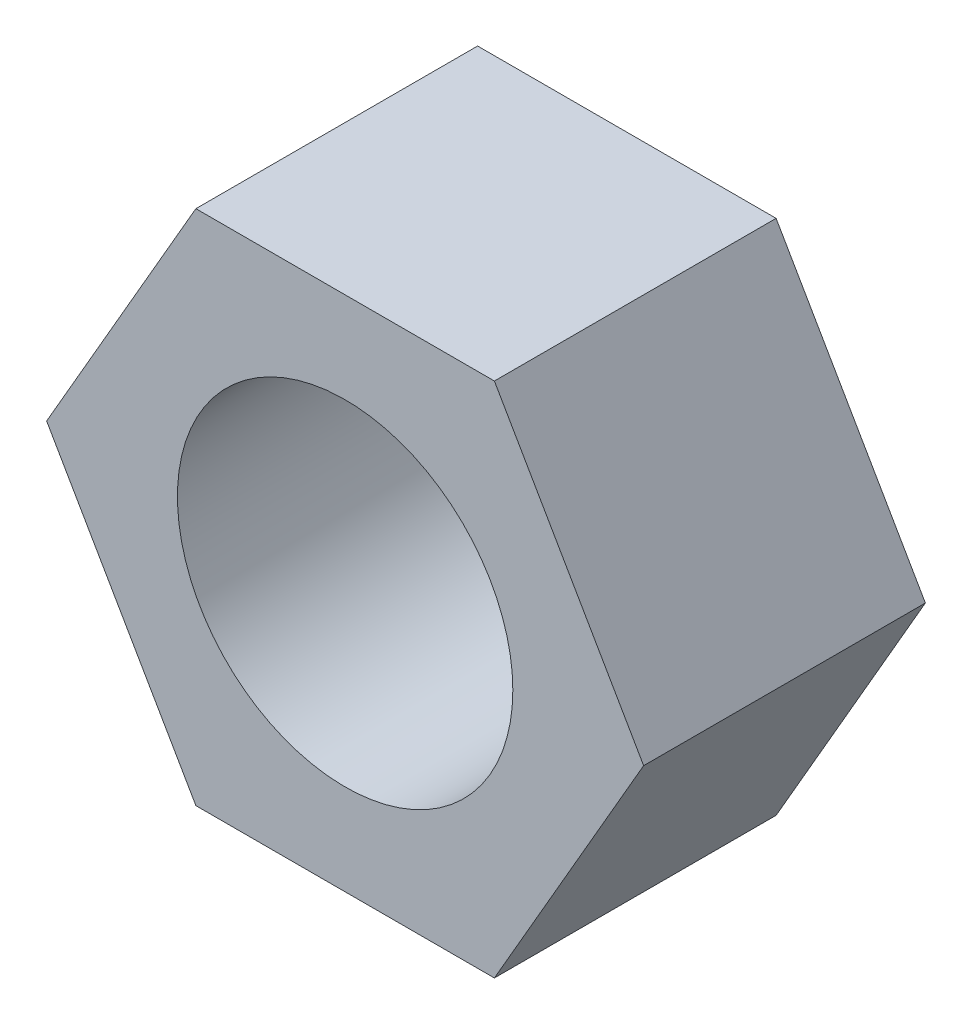
ISO-10303-21;
HEADER;
FILE_DESCRIPTION(('STEP AP214'),'2;1');
FILE_NAME('part.step','',(''),(''),'','','');
FILE_SCHEMA(('AUTOMOTIVE_DESIGN { 1 0 10303 214 1 1 1 1 }'));
ENDSEC;
DATA;
#1=APPLICATION_CONTEXT('core data for automotive mechanical design processes');
#2=APPLICATION_PROTOCOL_DEFINITION('international standard','automotive_design',2000,#1);
#3=PRODUCT_CONTEXT('',#1,'mechanical');
#4=PRODUCT('Part','Part','',(#3));
#5=PRODUCT_RELATED_PRODUCT_CATEGORY('part','',(#4));
#6=PRODUCT_DEFINITION_FORMATION('','',#4);
#7=PRODUCT_DEFINITION_CONTEXT('part definition',#1,'design');
#8=PRODUCT_DEFINITION('design','',#6,#7);
#9=PRODUCT_DEFINITION_SHAPE('','',#8);
#10=(LENGTH_UNIT() NAMED_UNIT(*) SI_UNIT(.MILLI.,.METRE.));
#11=(NAMED_UNIT(*) PLANE_ANGLE_UNIT() SI_UNIT($,.RADIAN.));
#12=(NAMED_UNIT(*) SI_UNIT($,.STERADIAN.) SOLID_ANGLE_UNIT());
#13=UNCERTAINTY_MEASURE_WITH_UNIT(LENGTH_MEASURE(1.E-05),#10,'distance_accuracy_value','');
#14=(GEOMETRIC_REPRESENTATION_CONTEXT(3) GLOBAL_UNCERTAINTY_ASSIGNED_CONTEXT((#13)) GLOBAL_UNIT_ASSIGNED_CONTEXT((#10,
#11,#12)) REPRESENTATION_CONTEXT('',''));
#15=CARTESIAN_POINT('',(0.,0.,0.));
#16=DIRECTION('',(0.,0.,1.));
#17=DIRECTION('',(1.,0.,0.));
#18=AXIS2_PLACEMENT_3D('',#15,#16,#17);
#19=CARTESIAN_POINT('',(4.45,-7.70762609368151,8.4));
#20=DIRECTION('',(-0.866025403784439,0.5,0.));
#21=DIRECTION('',(-0.5,-0.866025403784439,0.));
#22=AXIS2_PLACEMENT_3D('',#19,#20,#21);
#23=PLANE('',#22);
#24=DIRECTION('',(0.5,0.866025403784439,0.));
#25=VECTOR('',#24,1.);
#26=CARTESIAN_POINT('',(4.45,-7.70762609368151,0.));
#27=LINE('',#26,#25);
#28=CARTESIAN_POINT('',(4.45,-7.70762609368151,0.));
#29=VERTEX_POINT('',#28);
#30=CARTESIAN_POINT('',(8.9,0.,0.));
#31=VERTEX_POINT('',#30);
#32=EDGE_CURVE('E119',#29,#31,#27,.T.);
#33=ORIENTED_EDGE('',*,*,#32,.T.);
#34=DIRECTION('',(0.,0.,-1.));
#35=VECTOR('',#34,1.);
#36=CARTESIAN_POINT('',(8.9,0.,8.4));
#37=LINE('',#36,#35);
#38=CARTESIAN_POINT('',(8.9,0.,8.4));
#39=VERTEX_POINT('',#38);
#40=EDGE_CURVE('E11',#39,#31,#37,.T.);
#41=ORIENTED_EDGE('',*,*,#40,.F.);
#42=DIRECTION('',(0.5,0.866025403784439,0.));
#43=VECTOR('',#42,1.);
#44=CARTESIAN_POINT('',(4.45,-7.70762609368151,8.4));
#45=LINE('',#44,#43);
#46=CARTESIAN_POINT('',(4.45,-7.70762609368151,8.4));
#47=VERTEX_POINT('',#46);
#48=EDGE_CURVE('E129',#47,#39,#45,.T.);
#49=ORIENTED_EDGE('',*,*,#48,.F.);
#50=DIRECTION('',(0.,0.,-1.));
#51=VECTOR('',#50,1.);
#52=CARTESIAN_POINT('',(4.45,-7.70762609368151,8.4));
#53=LINE('',#52,#51);
#54=EDGE_CURVE('E115',#47,#29,#53,.T.);
#55=ORIENTED_EDGE('',*,*,#54,.T.);
#56=EDGE_LOOP('',(#33,#41,#49,#55));
#57=FACE_BOUND('',#56,.T.);
#58=ADVANCED_FACE('F34',(#57),#23,.F.);
#59=CARTESIAN_POINT('',(8.9,0.,8.4));
#60=DIRECTION('',(-0.866025403784439,-0.5,0.));
#61=DIRECTION('',(0.5,-0.866025403784439,0.));
#62=AXIS2_PLACEMENT_3D('',#59,#60,#61);
#63=PLANE('',#62);
#64=DIRECTION('',(-0.5,0.866025403784439,0.));
#65=VECTOR('',#64,1.);
#66=CARTESIAN_POINT('',(8.9,0.,0.));
#67=LINE('',#66,#65);
#68=CARTESIAN_POINT('',(4.45,7.70762609368151,0.));
#69=VERTEX_POINT('',#68);
#70=EDGE_CURVE('E122',#31,#69,#67,.T.);
#71=ORIENTED_EDGE('',*,*,#70,.T.);
#72=DIRECTION('',(0.,0.,-1.));
#73=VECTOR('',#72,1.);
#74=CARTESIAN_POINT('',(4.45,7.70762609368151,8.4));
#75=LINE('',#74,#73);
#76=CARTESIAN_POINT('',(4.45,7.70762609368151,8.4));
#77=VERTEX_POINT('',#76);
#78=EDGE_CURVE('E43',#77,#69,#75,.T.);
#79=ORIENTED_EDGE('',*,*,#78,.F.);
#80=DIRECTION('',(-0.5,0.866025403784439,0.));
#81=VECTOR('',#80,1.);
#82=CARTESIAN_POINT('',(8.9,0.,8.4));
#83=LINE('',#82,#81);
#84=EDGE_CURVE('E88',#39,#77,#83,.T.);
#85=ORIENTED_EDGE('',*,*,#84,.F.);
#86=ORIENTED_EDGE('',*,*,#40,.T.);
#87=EDGE_LOOP('',(#71,#79,#85,#86));
#88=FACE_BOUND('',#87,.T.);
#89=ADVANCED_FACE('F155',(#88),#63,.F.);
#90=CARTESIAN_POINT('',(4.45,7.70762609368151,8.4));
#91=DIRECTION('',(0.,-1.,0.));
#92=DIRECTION('',(1.,0.,0.));
#93=AXIS2_PLACEMENT_3D('',#90,#91,#92);
#94=PLANE('',#93);
#95=DIRECTION('',(-1.,0.,0.));
#96=VECTOR('',#95,1.);
#97=CARTESIAN_POINT('',(4.45,7.70762609368151,0.));
#98=LINE('',#97,#96);
#99=CARTESIAN_POINT('',(-4.45,7.70762609368151,0.));
#100=VERTEX_POINT('',#99);
#101=EDGE_CURVE('E124',#69,#100,#98,.T.);
#102=ORIENTED_EDGE('',*,*,#101,.T.);
#103=DIRECTION('',(0.,0.,-1.));
#104=VECTOR('',#103,1.);
#105=CARTESIAN_POINT('',(-4.45,7.70762609368151,8.4));
#106=LINE('',#105,#104);
#107=CARTESIAN_POINT('',(-4.45,7.70762609368151,8.4));
#108=VERTEX_POINT('',#107);
#109=EDGE_CURVE('E110',#108,#100,#106,.T.);
#110=ORIENTED_EDGE('',*,*,#109,.F.);
#111=DIRECTION('',(-1.,0.,0.));
#112=VECTOR('',#111,1.);
#113=CARTESIAN_POINT('',(4.45,7.70762609368151,8.4));
#114=LINE('',#113,#112);
#115=EDGE_CURVE('E101',#77,#108,#114,.T.);
#116=ORIENTED_EDGE('',*,*,#115,.F.);
#117=ORIENTED_EDGE('',*,*,#78,.T.);
#118=EDGE_LOOP('',(#102,#110,#116,#117));
#119=FACE_BOUND('',#118,.T.);
#120=ADVANCED_FACE('F136',(#119),#94,.F.);
#121=CARTESIAN_POINT('',(-4.45,7.70762609368151,8.4));
#122=DIRECTION('',(0.866025403784439,-0.5,0.));
#123=DIRECTION('',(0.5,0.866025403784439,0.));
#124=AXIS2_PLACEMENT_3D('',#121,#122,#123);
#125=PLANE('',#124);
#126=DIRECTION('',(-0.5,-0.866025403784439,0.));
#127=VECTOR('',#126,1.);
#128=CARTESIAN_POINT('',(-4.45,7.70762609368151,0.));
#129=LINE('',#128,#127);
#130=CARTESIAN_POINT('',(-8.9,0.,0.));
#131=VERTEX_POINT('',#130);
#132=EDGE_CURVE('E109',#100,#131,#129,.T.);
#133=ORIENTED_EDGE('',*,*,#132,.T.);
#134=DIRECTION('',(0.,0.,-1.));
#135=VECTOR('',#134,1.);
#136=CARTESIAN_POINT('',(-8.9,0.,8.4));
#137=LINE('',#136,#135);
#138=CARTESIAN_POINT('',(-8.9,0.,8.4));
#139=VERTEX_POINT('',#138);
#140=EDGE_CURVE('E106',#139,#131,#137,.T.);
#141=ORIENTED_EDGE('',*,*,#140,.F.);
#142=DIRECTION('',(-0.5,-0.866025403784439,0.));
#143=VECTOR('',#142,1.);
#144=CARTESIAN_POINT('',(-4.45,7.70762609368151,8.4));
#145=LINE('',#144,#143);
#146=EDGE_CURVE('E95',#108,#139,#145,.T.);
#147=ORIENTED_EDGE('',*,*,#146,.F.);
#148=ORIENTED_EDGE('',*,*,#109,.T.);
#149=EDGE_LOOP('',(#133,#141,#147,#148));
#150=FACE_BOUND('',#149,.T.);
#151=ADVANCED_FACE('F107',(#150),#125,.F.);
#152=CARTESIAN_POINT('',(-8.9,0.,8.4));
#153=DIRECTION('',(0.866025403784439,0.5,0.));
#154=DIRECTION('',(-0.5,0.866025403784439,0.));
#155=AXIS2_PLACEMENT_3D('',#152,#153,#154);
#156=PLANE('',#155);
#157=DIRECTION('',(0.5,-0.866025403784439,0.));
#158=VECTOR('',#157,1.);
#159=CARTESIAN_POINT('',(-8.9,0.,0.));
#160=LINE('',#159,#158);
#161=CARTESIAN_POINT('',(-4.45,-7.70762609368151,0.));
#162=VERTEX_POINT('',#161);
#163=EDGE_CURVE('E74',#131,#162,#160,.T.);
#164=ORIENTED_EDGE('',*,*,#163,.T.);
#165=DIRECTION('',(0.,0.,-1.));
#166=VECTOR('',#165,1.);
#167=CARTESIAN_POINT('',(-4.45,-7.70762609368151,8.4));
#168=LINE('',#167,#166);
#169=CARTESIAN_POINT('',(-4.45,-7.70762609368151,8.4));
#170=VERTEX_POINT('',#169);
#171=EDGE_CURVE('E111',#170,#162,#168,.T.);
#172=ORIENTED_EDGE('',*,*,#171,.F.);
#173=DIRECTION('',(0.5,-0.866025403784439,0.));
#174=VECTOR('',#173,1.);
#175=CARTESIAN_POINT('',(-8.9,0.,8.4));
#176=LINE('',#175,#174);
#177=EDGE_CURVE('E99',#139,#170,#176,.T.);
#178=ORIENTED_EDGE('',*,*,#177,.F.);
#179=ORIENTED_EDGE('',*,*,#140,.T.);
#180=EDGE_LOOP('',(#164,#172,#178,#179));
#181=FACE_BOUND('',#180,.T.);
#182=ADVANCED_FACE('F113',(#181),#156,.F.);
#183=CARTESIAN_POINT('',(-4.45,-7.70762609368151,8.4));
#184=DIRECTION('',(0.,1.,0.));
#185=DIRECTION('',(-1.,0.,0.));
#186=AXIS2_PLACEMENT_3D('',#183,#184,#185);
#187=PLANE('',#186);
#188=DIRECTION('',(1.,0.,0.));
#189=VECTOR('',#188,1.);
#190=CARTESIAN_POINT('',(-4.45,-7.70762609368151,0.));
#191=LINE('',#190,#189);
#192=EDGE_CURVE('E80',#162,#29,#191,.T.);
#193=ORIENTED_EDGE('',*,*,#192,.T.);
#194=ORIENTED_EDGE('',*,*,#54,.F.);
#195=DIRECTION('',(1.,0.,0.));
#196=VECTOR('',#195,1.);
#197=CARTESIAN_POINT('',(-4.45,-7.70762609368151,8.4));
#198=LINE('',#197,#196);
#199=EDGE_CURVE('E51',#170,#47,#198,.T.);
#200=ORIENTED_EDGE('',*,*,#199,.F.);
#201=ORIENTED_EDGE('',*,*,#171,.T.);
#202=EDGE_LOOP('',(#193,#194,#200,#201));
#203=FACE_BOUND('',#202,.T.);
#204=ADVANCED_FACE('F143',(#203),#187,.F.);
#205=CARTESIAN_POINT('',(0.,0.,8.4));
#206=DIRECTION('',(0.,0.,1.));
#207=DIRECTION('',(1.,0.,0.));
#208=AXIS2_PLACEMENT_3D('',#205,#206,#207);
#209=PLANE('',#208);
#210=CARTESIAN_POINT('',(0.,0.,8.4));
#211=DIRECTION('',(0.,0.,1.));
#212=DIRECTION('',(1.,0.,0.));
#213=AXIS2_PLACEMENT_3D('',#210,#211,#212);
#214=CIRCLE('',#213,5.);
#215=CARTESIAN_POINT('',(5.,0.,8.4));
#216=VERTEX_POINT('',#215);
#217=EDGE_CURVE('E208',#216,#216,#214,.T.);
#218=ORIENTED_EDGE('',*,*,#217,.F.);
#219=EDGE_LOOP('',(#218));
#220=FACE_BOUND('',#219,.T.);
#221=ORIENTED_EDGE('',*,*,#48,.T.);
#222=ORIENTED_EDGE('',*,*,#84,.T.);
#223=ORIENTED_EDGE('',*,*,#115,.T.);
#224=ORIENTED_EDGE('',*,*,#146,.T.);
#225=ORIENTED_EDGE('',*,*,#177,.T.);
#226=ORIENTED_EDGE('',*,*,#199,.T.);
#227=EDGE_LOOP('',(#221,#222,#223,#224,#225,#226));
#228=FACE_BOUND('',#227,.T.);
#229=ADVANCED_FACE('F97',(#220,#228),#209,.T.);
#230=CARTESIAN_POINT('',(0.,0.,0.));
#231=DIRECTION('',(0.,0.,1.));
#232=DIRECTION('',(1.,0.,0.));
#233=AXIS2_PLACEMENT_3D('',#230,#231,#232);
#234=PLANE('',#233);
#235=CARTESIAN_POINT('',(0.,0.,0.));
#236=DIRECTION('',(0.,0.,1.));
#237=DIRECTION('',(1.,0.,0.));
#238=AXIS2_PLACEMENT_3D('',#235,#236,#237);
#239=CIRCLE('',#238,5.);
#240=CARTESIAN_POINT('',(5.,0.,0.));
#241=VERTEX_POINT('',#240);
#242=EDGE_CURVE('E37',#241,#241,#239,.T.);
#243=ORIENTED_EDGE('',*,*,#242,.T.);
#244=EDGE_LOOP('',(#243));
#245=FACE_BOUND('',#244,.T.);
#246=ORIENTED_EDGE('',*,*,#32,.F.);
#247=ORIENTED_EDGE('',*,*,#192,.F.);
#248=ORIENTED_EDGE('',*,*,#163,.F.);
#249=ORIENTED_EDGE('',*,*,#132,.F.);
#250=ORIENTED_EDGE('',*,*,#101,.F.);
#251=ORIENTED_EDGE('',*,*,#70,.F.);
#252=EDGE_LOOP('',(#246,#247,#248,#249,#250,#251));
#253=FACE_BOUND('',#252,.T.);
#254=ADVANCED_FACE('F139',(#245,#253),#234,.F.);
#255=CARTESIAN_POINT('',(0.,0.,-56.6));
#256=DIRECTION('',(0.,0.,1.));
#257=DIRECTION('',(1.,0.,0.));
#258=AXIS2_PLACEMENT_3D('',#255,#256,#257);
#259=CYLINDRICAL_SURFACE('',#258,5.);
#260=ORIENTED_EDGE('',*,*,#217,.T.);
#261=EDGE_LOOP('',(#260));
#262=FACE_BOUND('',#261,.T.);
#263=ORIENTED_EDGE('',*,*,#242,.F.);
#264=EDGE_LOOP('',(#263));
#265=FACE_BOUND('',#264,.T.);
#266=ADVANCED_FACE('F192',(#262,#265),#259,.F.);
#267=CLOSED_SHELL('',(#58,#89,#120,#151,#182,#204,#229,#254,#266));
#268=MANIFOLD_SOLID_BREP('B2',#267);
#269=ADVANCED_BREP_SHAPE_REPRESENTATION('',(#18,#268),#14);
#270=SHAPE_DEFINITION_REPRESENTATION(#9,#269);
ENDSEC;
END-ISO-10303-21;
